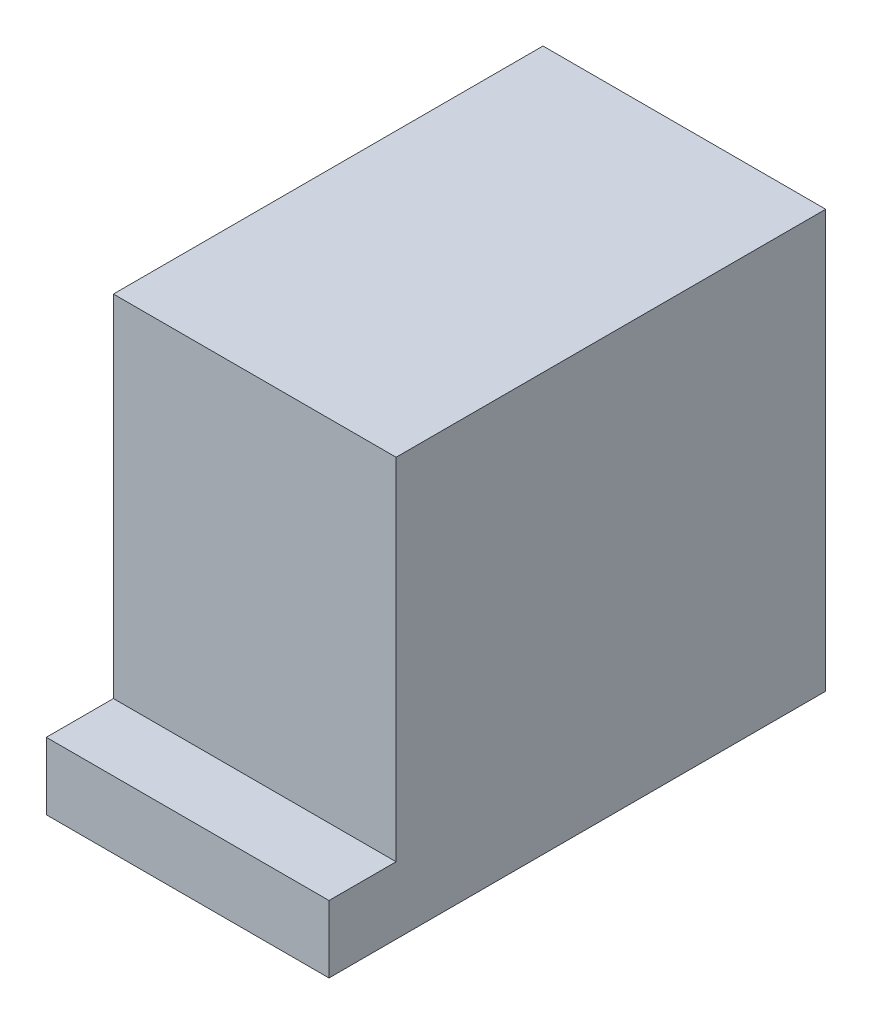
ISO-10303-21;
HEADER;
FILE_DESCRIPTION(('STEP AP214'),'2;1');
FILE_NAME('part.step','',(''),(''),'','','');
FILE_SCHEMA(('AUTOMOTIVE_DESIGN { 1 0 10303 214 1 1 1 1 }'));
ENDSEC;
DATA;
#1=APPLICATION_CONTEXT('core data for automotive mechanical design processes');
#2=APPLICATION_PROTOCOL_DEFINITION('international standard','automotive_design',2000,#1);
#3=PRODUCT_CONTEXT('',#1,'mechanical');
#4=PRODUCT('Part','Part','',(#3));
#5=PRODUCT_RELATED_PRODUCT_CATEGORY('part','',(#4));
#6=PRODUCT_DEFINITION_FORMATION('','',#4);
#7=PRODUCT_DEFINITION_CONTEXT('part definition',#1,'design');
#8=PRODUCT_DEFINITION('design','',#6,#7);
#9=PRODUCT_DEFINITION_SHAPE('','',#8);
#10=(LENGTH_UNIT() NAMED_UNIT(*) SI_UNIT(.MILLI.,.METRE.));
#11=(NAMED_UNIT(*) PLANE_ANGLE_UNIT() SI_UNIT($,.RADIAN.));
#12=(NAMED_UNIT(*) SI_UNIT($,.STERADIAN.) SOLID_ANGLE_UNIT());
#13=UNCERTAINTY_MEASURE_WITH_UNIT(LENGTH_MEASURE(1.E-05),#10,'distance_accuracy_value','');
#14=(GEOMETRIC_REPRESENTATION_CONTEXT(3) GLOBAL_UNCERTAINTY_ASSIGNED_CONTEXT((#13)) GLOBAL_UNIT_ASSIGNED_CONTEXT((#10,
#11,#12)) REPRESENTATION_CONTEXT('',''));
#15=CARTESIAN_POINT('',(0.,0.,0.));
#16=DIRECTION('',(0.,0.,1.));
#17=DIRECTION('',(1.,0.,0.));
#18=AXIS2_PLACEMENT_3D('',#15,#16,#17);
#19=CARTESIAN_POINT('',(0.,50.8,0.));
#20=DIRECTION('',(0.,1.,0.));
#21=DIRECTION('',(0.,0.,1.));
#22=AXIS2_PLACEMENT_3D('',#19,#20,#21);
#23=PLANE('',#22);
#24=DIRECTION('',(0.,0.,-1.));
#25=VECTOR('',#24,1.);
#26=CARTESIAN_POINT('',(107.,50.8,188.));
#27=LINE('',#26,#25);
#28=CARTESIAN_POINT('',(107.,50.8,188.));
#29=VERTEX_POINT('',#28);
#30=CARTESIAN_POINT('',(107.,50.8,137.2));
#31=VERTEX_POINT('',#30);
#32=EDGE_CURVE('E48',#29,#31,#27,.T.);
#33=ORIENTED_EDGE('',*,*,#32,.T.);
#34=DIRECTION('',(-1.,0.,0.));
#35=VECTOR('',#34,1.);
#36=CARTESIAN_POINT('',(0.,50.8,137.2));
#37=LINE('',#36,#35);
#38=CARTESIAN_POINT('',(-107.,50.8,137.2));
#39=VERTEX_POINT('',#38);
#40=EDGE_CURVE('E52',#31,#39,#37,.T.);
#41=ORIENTED_EDGE('',*,*,#40,.T.);
#42=DIRECTION('',(0.,0.,1.));
#43=VECTOR('',#42,1.);
#44=CARTESIAN_POINT('',(-107.,50.8,188.));
#45=LINE('',#44,#43);
#46=CARTESIAN_POINT('',(-107.,50.8,188.));
#47=VERTEX_POINT('',#46);
#48=EDGE_CURVE('E106',#39,#47,#45,.T.);
#49=ORIENTED_EDGE('',*,*,#48,.T.);
#50=DIRECTION('',(1.,0.,0.));
#51=VECTOR('',#50,1.);
#52=CARTESIAN_POINT('',(107.,50.8,188.));
#53=LINE('',#52,#51);
#54=EDGE_CURVE('E114',#47,#29,#53,.T.);
#55=ORIENTED_EDGE('',*,*,#54,.T.);
#56=EDGE_LOOP('',(#33,#41,#49,#55));
#57=FACE_BOUND('',#56,.T.);
#58=ADVANCED_FACE('F33',(#57),#23,.T.);
#59=CARTESIAN_POINT('',(-107.,50.8,188.));
#60=DIRECTION('',(1.,0.,0.));
#61=DIRECTION('',(0.,0.,-1.));
#62=AXIS2_PLACEMENT_3D('',#59,#60,#61);
#63=PLANE('',#62);
#64=DIRECTION('',(0.,0.,1.));
#65=VECTOR('',#64,1.);
#66=CARTESIAN_POINT('',(-107.,0.,188.));
#67=LINE('',#66,#65);
#68=CARTESIAN_POINT('',(-107.,0.,-188.));
#69=VERTEX_POINT('',#68);
#70=CARTESIAN_POINT('',(-107.,0.,188.));
#71=VERTEX_POINT('',#70);
#72=EDGE_CURVE('E108',#69,#71,#67,.T.);
#73=ORIENTED_EDGE('',*,*,#72,.T.);
#74=DIRECTION('',(0.,-1.,0.));
#75=VECTOR('',#74,1.);
#76=CARTESIAN_POINT('',(-107.,50.8,188.));
#77=LINE('',#76,#75);
#78=EDGE_CURVE('E11',#47,#71,#77,.T.);
#79=ORIENTED_EDGE('',*,*,#78,.F.);
#80=ORIENTED_EDGE('',*,*,#48,.F.);
#81=DIRECTION('',(0.,-1.,0.));
#82=VECTOR('',#81,1.);
#83=CARTESIAN_POINT('',(-107.,316.,137.2));
#84=LINE('',#83,#82);
#85=CARTESIAN_POINT('',(-107.,316.,137.2));
#86=VERTEX_POINT('',#85);
#87=EDGE_CURVE('E88',#86,#39,#84,.T.);
#88=ORIENTED_EDGE('',*,*,#87,.F.);
#89=DIRECTION('',(0.,0.,1.));
#90=VECTOR('',#89,1.);
#91=CARTESIAN_POINT('',(-107.,316.,0.));
#92=LINE('',#91,#90);
#93=CARTESIAN_POINT('',(-107.,316.,-188.));
#94=VERTEX_POINT('',#93);
#95=EDGE_CURVE('E95',#94,#86,#92,.T.);
#96=ORIENTED_EDGE('',*,*,#95,.F.);
#97=DIRECTION('',(0.,-1.,0.));
#98=VECTOR('',#97,1.);
#99=CARTESIAN_POINT('',(-107.,50.8,-188.));
#100=LINE('',#99,#98);
#101=EDGE_CURVE('E118',#94,#69,#100,.T.);
#102=ORIENTED_EDGE('',*,*,#101,.T.);
#103=EDGE_LOOP('',(#73,#79,#80,#88,#96,#102));
#104=FACE_BOUND('',#103,.T.);
#105=ADVANCED_FACE('F35',(#104),#63,.F.);
#106=CARTESIAN_POINT('',(107.,50.8,188.));
#107=DIRECTION('',(0.,0.,-1.));
#108=DIRECTION('',(-1.,0.,0.));
#109=AXIS2_PLACEMENT_3D('',#106,#107,#108);
#110=PLANE('',#109);
#111=DIRECTION('',(1.,0.,0.));
#112=VECTOR('',#111,1.);
#113=CARTESIAN_POINT('',(107.,0.,188.));
#114=LINE('',#113,#112);
#115=CARTESIAN_POINT('',(107.,0.,188.));
#116=VERTEX_POINT('',#115);
#117=EDGE_CURVE('E120',#71,#116,#114,.T.);
#118=ORIENTED_EDGE('',*,*,#117,.T.);
#119=DIRECTION('',(0.,-1.,0.));
#120=VECTOR('',#119,1.);
#121=CARTESIAN_POINT('',(107.,50.8,188.));
#122=LINE('',#121,#120);
#123=EDGE_CURVE('E41',#29,#116,#122,.T.);
#124=ORIENTED_EDGE('',*,*,#123,.F.);
#125=ORIENTED_EDGE('',*,*,#54,.F.);
#126=ORIENTED_EDGE('',*,*,#78,.T.);
#127=EDGE_LOOP('',(#118,#124,#125,#126));
#128=FACE_BOUND('',#127,.T.);
#129=ADVANCED_FACE('F142',(#128),#110,.F.);
#130=CARTESIAN_POINT('',(107.,50.8,188.));
#131=DIRECTION('',(-1.,0.,0.));
#132=DIRECTION('',(0.,0.,1.));
#133=AXIS2_PLACEMENT_3D('',#130,#131,#132);
#134=PLANE('',#133);
#135=DIRECTION('',(0.,-1.,0.));
#136=VECTOR('',#135,1.);
#137=CARTESIAN_POINT('',(107.,50.8,-188.));
#138=LINE('',#137,#136);
#139=CARTESIAN_POINT('',(107.,316.,-188.));
#140=VERTEX_POINT('',#139);
#141=CARTESIAN_POINT('',(107.,0.,-188.));
#142=VERTEX_POINT('',#141);
#143=EDGE_CURVE('E126',#140,#142,#138,.T.);
#144=ORIENTED_EDGE('',*,*,#143,.F.);
#145=DIRECTION('',(0.,0.,-1.));
#146=VECTOR('',#145,1.);
#147=CARTESIAN_POINT('',(107.,316.,0.));
#148=LINE('',#147,#146);
#149=CARTESIAN_POINT('',(107.,316.,137.2));
#150=VERTEX_POINT('',#149);
#151=EDGE_CURVE('E94',#150,#140,#148,.T.);
#152=ORIENTED_EDGE('',*,*,#151,.F.);
#153=DIRECTION('',(0.,-1.,0.));
#154=VECTOR('',#153,1.);
#155=CARTESIAN_POINT('',(107.,316.,137.2));
#156=LINE('',#155,#154);
#157=EDGE_CURVE('E90',#150,#31,#156,.T.);
#158=ORIENTED_EDGE('',*,*,#157,.T.);
#159=ORIENTED_EDGE('',*,*,#32,.F.);
#160=ORIENTED_EDGE('',*,*,#123,.T.);
#161=DIRECTION('',(0.,0.,-1.));
#162=VECTOR('',#161,1.);
#163=CARTESIAN_POINT('',(107.,0.,188.));
#164=LINE('',#163,#162);
#165=EDGE_CURVE('E122',#116,#142,#164,.T.);
#166=ORIENTED_EDGE('',*,*,#165,.T.);
#167=EDGE_LOOP('',(#144,#152,#158,#159,#160,#166));
#168=FACE_BOUND('',#167,.T.);
#169=ADVANCED_FACE('F132',(#168),#134,.F.);
#170=CARTESIAN_POINT('',(107.,50.8,-188.));
#171=DIRECTION('',(0.,0.,1.));
#172=DIRECTION('',(1.,0.,0.));
#173=AXIS2_PLACEMENT_3D('',#170,#171,#172);
#174=PLANE('',#173);
#175=DIRECTION('',(-1.,0.,0.));
#176=VECTOR('',#175,1.);
#177=CARTESIAN_POINT('',(107.,0.,-188.));
#178=LINE('',#177,#176);
#179=EDGE_CURVE('E115',#142,#69,#178,.T.);
#180=ORIENTED_EDGE('',*,*,#179,.T.);
#181=ORIENTED_EDGE('',*,*,#101,.F.);
#182=DIRECTION('',(-1.,0.,0.));
#183=VECTOR('',#182,1.);
#184=CARTESIAN_POINT('',(0.,316.,-188.));
#185=LINE('',#184,#183);
#186=EDGE_CURVE('E101',#140,#94,#185,.T.);
#187=ORIENTED_EDGE('',*,*,#186,.F.);
#188=ORIENTED_EDGE('',*,*,#143,.T.);
#189=EDGE_LOOP('',(#180,#181,#187,#188));
#190=FACE_BOUND('',#189,.T.);
#191=ADVANCED_FACE('F141',(#190),#174,.F.);
#192=CARTESIAN_POINT('',(0.,0.,0.));
#193=DIRECTION('',(0.,1.,0.));
#194=DIRECTION('',(0.,0.,1.));
#195=AXIS2_PLACEMENT_3D('',#192,#193,#194);
#196=PLANE('',#195);
#197=ORIENTED_EDGE('',*,*,#179,.F.);
#198=ORIENTED_EDGE('',*,*,#165,.F.);
#199=ORIENTED_EDGE('',*,*,#117,.F.);
#200=ORIENTED_EDGE('',*,*,#72,.F.);
#201=EDGE_LOOP('',(#197,#198,#199,#200));
#202=FACE_BOUND('',#201,.T.);
#203=ADVANCED_FACE('F138',(#202),#196,.F.);
#204=CARTESIAN_POINT('',(0.,316.,137.2));
#205=DIRECTION('',(0.,0.,-1.));
#206=DIRECTION('',(-1.,0.,0.));
#207=AXIS2_PLACEMENT_3D('',#204,#205,#206);
#208=PLANE('',#207);
#209=ORIENTED_EDGE('',*,*,#40,.F.);
#210=ORIENTED_EDGE('',*,*,#157,.F.);
#211=DIRECTION('',(1.,0.,0.));
#212=VECTOR('',#211,1.);
#213=CARTESIAN_POINT('',(0.,316.,137.2));
#214=LINE('',#213,#212);
#215=EDGE_CURVE('E84',#86,#150,#214,.T.);
#216=ORIENTED_EDGE('',*,*,#215,.F.);
#217=ORIENTED_EDGE('',*,*,#87,.T.);
#218=EDGE_LOOP('',(#209,#210,#216,#217));
#219=FACE_BOUND('',#218,.T.);
#220=ADVANCED_FACE('F86',(#219),#208,.F.);
#221=CARTESIAN_POINT('',(0.,316.,0.));
#222=DIRECTION('',(0.,1.,0.));
#223=DIRECTION('',(0.,0.,1.));
#224=AXIS2_PLACEMENT_3D('',#221,#222,#223);
#225=PLANE('',#224);
#226=ORIENTED_EDGE('',*,*,#95,.T.);
#227=ORIENTED_EDGE('',*,*,#215,.T.);
#228=ORIENTED_EDGE('',*,*,#151,.T.);
#229=ORIENTED_EDGE('',*,*,#186,.T.);
#230=EDGE_LOOP('',(#226,#227,#228,#229));
#231=FACE_BOUND('',#230,.T.);
#232=ADVANCED_FACE('F99',(#231),#225,.T.);
#233=CLOSED_SHELL('',(#58,#105,#129,#169,#191,#203,#220,#232));
#234=MANIFOLD_SOLID_BREP('B2',#233);
#235=ADVANCED_BREP_SHAPE_REPRESENTATION('',(#18,#234),#14);
#236=SHAPE_DEFINITION_REPRESENTATION(#9,#235);
ENDSEC;
END-ISO-10303-21;
